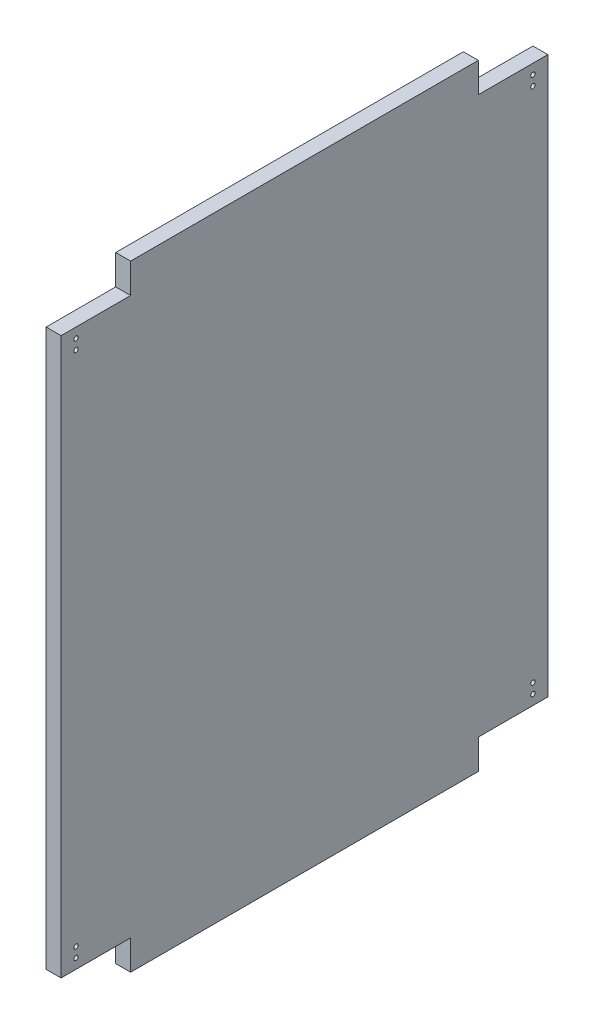
ISO-10303-21;
HEADER;
FILE_DESCRIPTION(('STEP AP214'),'2;1');
FILE_NAME('part.step','',(''),(''),'','','');
FILE_SCHEMA(('AUTOMOTIVE_DESIGN { 1 0 10303 214 1 1 1 1 }'));
ENDSEC;
DATA;
#1=APPLICATION_CONTEXT('core data for automotive mechanical design processes');
#2=APPLICATION_PROTOCOL_DEFINITION('international standard','automotive_design',2000,#1);
#3=PRODUCT_CONTEXT('',#1,'mechanical');
#4=PRODUCT('Part','Part','',(#3));
#5=PRODUCT_RELATED_PRODUCT_CATEGORY('part','',(#4));
#6=PRODUCT_DEFINITION_FORMATION('','',#4);
#7=PRODUCT_DEFINITION_CONTEXT('part definition',#1,'design');
#8=PRODUCT_DEFINITION('design','',#6,#7);
#9=PRODUCT_DEFINITION_SHAPE('','',#8);
#10=(LENGTH_UNIT() NAMED_UNIT(*) SI_UNIT(.MILLI.,.METRE.));
#11=(NAMED_UNIT(*) PLANE_ANGLE_UNIT() SI_UNIT($,.RADIAN.));
#12=(NAMED_UNIT(*) SI_UNIT($,.STERADIAN.) SOLID_ANGLE_UNIT());
#13=UNCERTAINTY_MEASURE_WITH_UNIT(LENGTH_MEASURE(1.E-05),#10,'distance_accuracy_value','');
#14=(GEOMETRIC_REPRESENTATION_CONTEXT(3) GLOBAL_UNCERTAINTY_ASSIGNED_CONTEXT((#13)) GLOBAL_UNIT_ASSIGNED_CONTEXT((#10,
#11,#12)) REPRESENTATION_CONTEXT('',''));
#15=CARTESIAN_POINT('',(0.,0.,0.));
#16=DIRECTION('',(0.,0.,1.));
#17=DIRECTION('',(1.,0.,0.));
#18=AXIS2_PLACEMENT_3D('',#15,#16,#17);
#19=CARTESIAN_POINT('',(-19.05,0.,0.));
#20=DIRECTION('',(0.,0.,-1.));
#21=DIRECTION('',(0.,1.,0.));
#22=AXIS2_PLACEMENT_3D('',#19,#20,#21);
#23=PLANE('',#22);
#24=DIRECTION('',(-1.,0.,0.));
#25=VECTOR('',#24,1.);
#26=CARTESIAN_POINT('',(0.,38.1,0.));
#27=LINE('',#26,#25);
#28=CARTESIAN_POINT('',(0.,38.1,0.));
#29=VERTEX_POINT('',#28);
#30=CARTESIAN_POINT('',(-19.05,38.1,0.));
#31=VERTEX_POINT('',#30);
#32=EDGE_CURVE('E203',#29,#31,#27,.T.);
#33=ORIENTED_EDGE('',*,*,#32,.T.);
#34=DIRECTION('',(0.,1.,0.));
#35=VECTOR('',#34,1.);
#36=CARTESIAN_POINT('',(-19.05,0.,0.));
#37=LINE('',#36,#35);
#38=CARTESIAN_POINT('',(-19.05,749.3,0.));
#39=VERTEX_POINT('',#38);
#40=EDGE_CURVE('E156',#31,#39,#37,.T.);
#41=ORIENTED_EDGE('',*,*,#40,.T.);
#42=DIRECTION('',(-1.,0.,0.));
#43=VECTOR('',#42,1.);
#44=CARTESIAN_POINT('',(0.,749.3,0.));
#45=LINE('',#44,#43);
#46=CARTESIAN_POINT('',(0.,749.3,0.));
#47=VERTEX_POINT('',#46);
#48=EDGE_CURVE('E176',#47,#39,#45,.T.);
#49=ORIENTED_EDGE('',*,*,#48,.F.);
#50=DIRECTION('',(0.,1.,0.));
#51=VECTOR('',#50,1.);
#52=CARTESIAN_POINT('',(0.,0.,0.));
#53=LINE('',#52,#51);
#54=EDGE_CURVE('E160',#29,#47,#53,.T.);
#55=ORIENTED_EDGE('',*,*,#54,.F.);
#56=EDGE_LOOP('',(#33,#41,#49,#55));
#57=FACE_BOUND('',#56,.T.);
#58=ADVANCED_FACE('F36',(#57),#23,.T.);
#59=CARTESIAN_POINT('',(-19.05,0.,0.));
#60=DIRECTION('',(0.,-1.,0.));
#61=DIRECTION('',(0.,0.,-1.));
#62=AXIS2_PLACEMENT_3D('',#59,#60,#61);
#63=PLANE('',#62);
#64=DIRECTION('',(-1.,0.,0.));
#65=VECTOR('',#64,1.);
#66=CARTESIAN_POINT('',(0.,0.,88.9));
#67=LINE('',#66,#65);
#68=CARTESIAN_POINT('',(0.,0.,88.9));
#69=VERTEX_POINT('',#68);
#70=CARTESIAN_POINT('',(-19.05,0.,88.9));
#71=VERTEX_POINT('',#70);
#72=EDGE_CURVE('E197',#69,#71,#67,.T.);
#73=ORIENTED_EDGE('',*,*,#72,.F.);
#74=DIRECTION('',(0.,0.,-1.));
#75=VECTOR('',#74,1.);
#76=CARTESIAN_POINT('',(0.,0.,0.));
#77=LINE('',#76,#75);
#78=CARTESIAN_POINT('',(0.,0.,533.4));
#79=VERTEX_POINT('',#78);
#80=EDGE_CURVE('E39',#79,#69,#77,.T.);
#81=ORIENTED_EDGE('',*,*,#80,.F.);
#82=DIRECTION('',(-1.,0.,0.));
#83=VECTOR('',#82,1.);
#84=CARTESIAN_POINT('',(0.,0.,533.4));
#85=LINE('',#84,#83);
#86=CARTESIAN_POINT('',(-19.05,0.,533.4));
#87=VERTEX_POINT('',#86);
#88=EDGE_CURVE('E201',#79,#87,#85,.T.);
#89=ORIENTED_EDGE('',*,*,#88,.T.);
#90=DIRECTION('',(0.,0.,-1.));
#91=VECTOR('',#90,1.);
#92=CARTESIAN_POINT('',(-19.05,0.,0.));
#93=LINE('',#92,#91);
#94=EDGE_CURVE('E11',#87,#71,#93,.T.);
#95=ORIENTED_EDGE('',*,*,#94,.T.);
#96=EDGE_LOOP('',(#73,#81,#89,#95));
#97=FACE_BOUND('',#96,.T.);
#98=ADVANCED_FACE('F324',(#97),#63,.T.);
#99=CARTESIAN_POINT('',(-19.05,0.,622.3));
#100=DIRECTION('',(0.,0.,1.));
#101=DIRECTION('',(1.,0.,0.));
#102=AXIS2_PLACEMENT_3D('',#99,#100,#101);
#103=PLANE('',#102);
#104=DIRECTION('',(-1.,0.,0.));
#105=VECTOR('',#104,1.);
#106=CARTESIAN_POINT('',(0.,38.1,622.3));
#107=LINE('',#106,#105);
#108=CARTESIAN_POINT('',(0.,38.1,622.3));
#109=VERTEX_POINT('',#108);
#110=CARTESIAN_POINT('',(-19.05,38.1,622.3));
#111=VERTEX_POINT('',#110);
#112=EDGE_CURVE('E213',#109,#111,#107,.T.);
#113=ORIENTED_EDGE('',*,*,#112,.F.);
#114=DIRECTION('',(0.,-1.,0.));
#115=VECTOR('',#114,1.);
#116=CARTESIAN_POINT('',(0.,0.,622.3));
#117=LINE('',#116,#115);
#118=CARTESIAN_POINT('',(0.,749.3,622.3));
#119=VERTEX_POINT('',#118);
#120=EDGE_CURVE('E145',#119,#109,#117,.T.);
#121=ORIENTED_EDGE('',*,*,#120,.F.);
#122=DIRECTION('',(-1.,0.,0.));
#123=VECTOR('',#122,1.);
#124=CARTESIAN_POINT('',(0.,749.3,622.3));
#125=LINE('',#124,#123);
#126=CARTESIAN_POINT('',(-19.05,749.3,622.3));
#127=VERTEX_POINT('',#126);
#128=EDGE_CURVE('E128',#119,#127,#125,.T.);
#129=ORIENTED_EDGE('',*,*,#128,.T.);
#130=DIRECTION('',(0.,-1.,0.));
#131=VECTOR('',#130,1.);
#132=CARTESIAN_POINT('',(-19.05,0.,622.3));
#133=LINE('',#132,#131);
#134=EDGE_CURVE('E44',#127,#111,#133,.T.);
#135=ORIENTED_EDGE('',*,*,#134,.T.);
#136=EDGE_LOOP('',(#113,#121,#129,#135));
#137=FACE_BOUND('',#136,.T.);
#138=ADVANCED_FACE('F143',(#137),#103,.T.);
#139=CARTESIAN_POINT('',(-19.05,787.4,0.));
#140=DIRECTION('',(0.,1.,0.));
#141=DIRECTION('',(0.,0.,1.));
#142=AXIS2_PLACEMENT_3D('',#139,#140,#141);
#143=PLANE('',#142);
#144=DIRECTION('',(-1.,0.,0.));
#145=VECTOR('',#144,1.);
#146=CARTESIAN_POINT('',(0.,787.4,533.4));
#147=LINE('',#146,#145);
#148=CARTESIAN_POINT('',(0.,787.4,533.4));
#149=VERTEX_POINT('',#148);
#150=CARTESIAN_POINT('',(-19.05,787.4,533.4));
#151=VERTEX_POINT('',#150);
#152=EDGE_CURVE('E225',#149,#151,#147,.T.);
#153=ORIENTED_EDGE('',*,*,#152,.F.);
#154=DIRECTION('',(0.,0.,1.));
#155=VECTOR('',#154,1.);
#156=CARTESIAN_POINT('',(0.,787.4,0.));
#157=LINE('',#156,#155);
#158=CARTESIAN_POINT('',(0.,787.4,88.9));
#159=VERTEX_POINT('',#158);
#160=EDGE_CURVE('E163',#159,#149,#157,.T.);
#161=ORIENTED_EDGE('',*,*,#160,.F.);
#162=DIRECTION('',(-1.,0.,0.));
#163=VECTOR('',#162,1.);
#164=CARTESIAN_POINT('',(0.,787.4,88.9));
#165=LINE('',#164,#163);
#166=CARTESIAN_POINT('',(-19.05,787.4,88.9));
#167=VERTEX_POINT('',#166);
#168=EDGE_CURVE('E164',#159,#167,#165,.T.);
#169=ORIENTED_EDGE('',*,*,#168,.T.);
#170=DIRECTION('',(0.,0.,1.));
#171=VECTOR('',#170,1.);
#172=CARTESIAN_POINT('',(-19.05,787.4,0.));
#173=LINE('',#172,#171);
#174=EDGE_CURVE('E153',#167,#151,#173,.T.);
#175=ORIENTED_EDGE('',*,*,#174,.T.);
#176=EDGE_LOOP('',(#153,#161,#169,#175));
#177=FACE_BOUND('',#176,.T.);
#178=ADVANCED_FACE('F309',(#177),#143,.T.);
#179=CARTESIAN_POINT('',(-19.05,0.,0.));
#180=DIRECTION('',(1.,0.,0.));
#181=DIRECTION('',(0.,0.,-1.));
#182=AXIS2_PLACEMENT_3D('',#179,#180,#181);
#183=PLANE('',#182);
#184=CARTESIAN_POINT('',(-19.05,50.8,603.25));
#185=DIRECTION('',(1.,0.,0.));
#186=DIRECTION('',(0.,0.,-1.));
#187=AXIS2_PLACEMENT_3D('',#184,#185,#186);
#188=CIRCLE('',#187,2.8067);
#189=CARTESIAN_POINT('',(-19.05,50.8,600.4433));
#190=VERTEX_POINT('',#189);
#191=EDGE_CURVE('E270',#190,#190,#188,.T.);
#192=ORIENTED_EDGE('',*,*,#191,.T.);
#193=EDGE_LOOP('',(#192));
#194=FACE_BOUND('',#193,.T.);
#195=CARTESIAN_POINT('',(-19.05,63.5,603.25));
#196=DIRECTION('',(1.,0.,0.));
#197=DIRECTION('',(0.,0.,-1.));
#198=AXIS2_PLACEMENT_3D('',#195,#196,#197);
#199=CIRCLE('',#198,2.8067);
#200=CARTESIAN_POINT('',(-19.05,63.5,600.4433));
#201=VERTEX_POINT('',#200);
#202=EDGE_CURVE('E264',#201,#201,#199,.T.);
#203=ORIENTED_EDGE('',*,*,#202,.T.);
#204=EDGE_LOOP('',(#203));
#205=FACE_BOUND('',#204,.T.);
#206=CARTESIAN_POINT('',(-19.05,50.8,19.05));
#207=DIRECTION('',(1.,0.,0.));
#208=DIRECTION('',(0.,0.,-1.));
#209=AXIS2_PLACEMENT_3D('',#206,#207,#208);
#210=CIRCLE('',#209,2.8067);
#211=CARTESIAN_POINT('',(-19.05,50.8,16.2433));
#212=VERTEX_POINT('',#211);
#213=EDGE_CURVE('E258',#212,#212,#210,.T.);
#214=ORIENTED_EDGE('',*,*,#213,.T.);
#215=EDGE_LOOP('',(#214));
#216=FACE_BOUND('',#215,.T.);
#217=CARTESIAN_POINT('',(-19.05,63.5,19.05));
#218=DIRECTION('',(1.,0.,0.));
#219=DIRECTION('',(0.,0.,-1.));
#220=AXIS2_PLACEMENT_3D('',#217,#218,#219);
#221=CIRCLE('',#220,2.8067);
#222=CARTESIAN_POINT('',(-19.05,63.5,16.2433));
#223=VERTEX_POINT('',#222);
#224=EDGE_CURVE('E252',#223,#223,#221,.T.);
#225=ORIENTED_EDGE('',*,*,#224,.T.);
#226=EDGE_LOOP('',(#225));
#227=FACE_BOUND('',#226,.T.);
#228=CARTESIAN_POINT('',(-19.05,723.9,19.0500000000001));
#229=DIRECTION('',(1.,0.,0.));
#230=DIRECTION('',(0.,0.,-1.));
#231=AXIS2_PLACEMENT_3D('',#228,#229,#230);
#232=CIRCLE('',#231,2.80670000000005);
#233=CARTESIAN_POINT('',(-19.05,723.9,16.2433));
#234=VERTEX_POINT('',#233);
#235=EDGE_CURVE('E246',#234,#234,#232,.T.);
#236=ORIENTED_EDGE('',*,*,#235,.T.);
#237=EDGE_LOOP('',(#236));
#238=FACE_BOUND('',#237,.T.);
#239=CARTESIAN_POINT('',(-19.05,736.6,19.0500000000001));
#240=DIRECTION('',(1.,0.,0.));
#241=DIRECTION('',(0.,0.,-1.));
#242=AXIS2_PLACEMENT_3D('',#239,#240,#241);
#243=CIRCLE('',#242,2.80670000000005);
#244=CARTESIAN_POINT('',(-19.05,736.6,16.2433));
#245=VERTEX_POINT('',#244);
#246=EDGE_CURVE('E240',#245,#245,#243,.T.);
#247=ORIENTED_EDGE('',*,*,#246,.T.);
#248=EDGE_LOOP('',(#247));
#249=FACE_BOUND('',#248,.T.);
#250=CARTESIAN_POINT('',(-19.05,723.9,603.25));
#251=DIRECTION('',(1.,0.,0.));
#252=DIRECTION('',(0.,0.,-1.));
#253=AXIS2_PLACEMENT_3D('',#250,#251,#252);
#254=CIRCLE('',#253,2.80670000000005);
#255=CARTESIAN_POINT('',(-19.05,723.9,600.4433));
#256=VERTEX_POINT('',#255);
#257=EDGE_CURVE('E234',#256,#256,#254,.T.);
#258=ORIENTED_EDGE('',*,*,#257,.T.);
#259=EDGE_LOOP('',(#258));
#260=FACE_BOUND('',#259,.T.);
#261=CARTESIAN_POINT('',(-19.05,736.6,603.25));
#262=DIRECTION('',(1.,0.,0.));
#263=DIRECTION('',(0.,0.,-1.));
#264=AXIS2_PLACEMENT_3D('',#261,#262,#263);
#265=CIRCLE('',#264,2.80670000000005);
#266=CARTESIAN_POINT('',(-19.05,736.6,600.4433));
#267=VERTEX_POINT('',#266);
#268=EDGE_CURVE('E206',#267,#267,#265,.T.);
#269=ORIENTED_EDGE('',*,*,#268,.T.);
#270=EDGE_LOOP('',(#269));
#271=FACE_BOUND('',#270,.T.);
#272=ORIENTED_EDGE('',*,*,#40,.F.);
#273=DIRECTION('',(0.,0.,-1.));
#274=VECTOR('',#273,1.);
#275=CARTESIAN_POINT('',(-19.05,38.1,0.));
#276=LINE('',#275,#274);
#277=CARTESIAN_POINT('',(-19.05,38.1,88.9));
#278=VERTEX_POINT('',#277);
#279=EDGE_CURVE('E195',#278,#31,#276,.T.);
#280=ORIENTED_EDGE('',*,*,#279,.F.);
#281=DIRECTION('',(0.,1.,0.));
#282=VECTOR('',#281,1.);
#283=CARTESIAN_POINT('',(-19.05,0.,88.9));
#284=LINE('',#283,#282);
#285=EDGE_CURVE('E198',#71,#278,#284,.T.);
#286=ORIENTED_EDGE('',*,*,#285,.F.);
#287=ORIENTED_EDGE('',*,*,#94,.F.);
#288=DIRECTION('',(0.,-1.,0.));
#289=VECTOR('',#288,1.);
#290=CARTESIAN_POINT('',(-19.05,0.,533.4));
#291=LINE('',#290,#289);
#292=CARTESIAN_POINT('',(-19.05,38.1,533.4));
#293=VERTEX_POINT('',#292);
#294=EDGE_CURVE('E211',#293,#87,#291,.T.);
#295=ORIENTED_EDGE('',*,*,#294,.F.);
#296=DIRECTION('',(0.,0.,-1.));
#297=VECTOR('',#296,1.);
#298=CARTESIAN_POINT('',(-19.05,38.1,622.3));
#299=LINE('',#298,#297);
#300=EDGE_CURVE('E146',#111,#293,#299,.T.);
#301=ORIENTED_EDGE('',*,*,#300,.F.);
#302=ORIENTED_EDGE('',*,*,#134,.F.);
#303=DIRECTION('',(0.,0.,1.));
#304=VECTOR('',#303,1.);
#305=CARTESIAN_POINT('',(-19.05,749.3,622.3));
#306=LINE('',#305,#304);
#307=CARTESIAN_POINT('',(-19.05,749.3,533.4));
#308=VERTEX_POINT('',#307);
#309=EDGE_CURVE('E125',#308,#127,#306,.T.);
#310=ORIENTED_EDGE('',*,*,#309,.F.);
#311=DIRECTION('',(0.,-1.,0.));
#312=VECTOR('',#311,1.);
#313=CARTESIAN_POINT('',(-19.05,787.4,533.4));
#314=LINE('',#313,#312);
#315=EDGE_CURVE('E136',#151,#308,#314,.T.);
#316=ORIENTED_EDGE('',*,*,#315,.F.);
#317=ORIENTED_EDGE('',*,*,#174,.F.);
#318=DIRECTION('',(0.,1.,0.));
#319=VECTOR('',#318,1.);
#320=CARTESIAN_POINT('',(-19.05,787.4,88.9));
#321=LINE('',#320,#319);
#322=CARTESIAN_POINT('',(-19.05,749.3,88.9));
#323=VERTEX_POINT('',#322);
#324=EDGE_CURVE('E183',#323,#167,#321,.T.);
#325=ORIENTED_EDGE('',*,*,#324,.F.);
#326=DIRECTION('',(0.,0.,1.));
#327=VECTOR('',#326,1.);
#328=CARTESIAN_POINT('',(-19.05,749.3,0.));
#329=LINE('',#328,#327);
#330=EDGE_CURVE('E186',#39,#323,#329,.T.);
#331=ORIENTED_EDGE('',*,*,#330,.F.);
#332=EDGE_LOOP('',(#272,#280,#286,#287,#295,#301,#302,#310,#316,#317,#325,#331));
#333=FACE_BOUND('',#332,.T.);
#334=ADVANCED_FACE('F150',(#194,#205,#216,#227,#238,#249,#260,#271,#333),#183,.F.);
#335=CARTESIAN_POINT('',(0.,0.,0.));
#336=DIRECTION('',(1.,0.,0.));
#337=DIRECTION('',(0.,0.,-1.));
#338=AXIS2_PLACEMENT_3D('',#335,#336,#337);
#339=PLANE('',#338);
#340=CARTESIAN_POINT('',(0.,50.8,603.25));
#341=DIRECTION('',(1.,0.,0.));
#342=DIRECTION('',(0.,0.,-1.));
#343=AXIS2_PLACEMENT_3D('',#340,#341,#342);
#344=CIRCLE('',#343,2.80669999999999);
#345=CARTESIAN_POINT('',(0.,50.8,600.4433));
#346=VERTEX_POINT('',#345);
#347=EDGE_CURVE('E273',#346,#346,#344,.T.);
#348=ORIENTED_EDGE('',*,*,#347,.F.);
#349=EDGE_LOOP('',(#348));
#350=FACE_BOUND('',#349,.T.);
#351=CARTESIAN_POINT('',(0.,63.5,603.25));
#352=DIRECTION('',(1.,0.,0.));
#353=DIRECTION('',(0.,0.,-1.));
#354=AXIS2_PLACEMENT_3D('',#351,#352,#353);
#355=CIRCLE('',#354,2.8067);
#356=CARTESIAN_POINT('',(0.,63.5,600.4433));
#357=VERTEX_POINT('',#356);
#358=EDGE_CURVE('E267',#357,#357,#355,.T.);
#359=ORIENTED_EDGE('',*,*,#358,.F.);
#360=EDGE_LOOP('',(#359));
#361=FACE_BOUND('',#360,.T.);
#362=CARTESIAN_POINT('',(0.,50.8,19.05));
#363=DIRECTION('',(1.,0.,0.));
#364=DIRECTION('',(0.,0.,-1.));
#365=AXIS2_PLACEMENT_3D('',#362,#363,#364);
#366=CIRCLE('',#365,2.80669999999999);
#367=CARTESIAN_POINT('',(0.,50.8,16.2433));
#368=VERTEX_POINT('',#367);
#369=EDGE_CURVE('E261',#368,#368,#366,.T.);
#370=ORIENTED_EDGE('',*,*,#369,.F.);
#371=EDGE_LOOP('',(#370));
#372=FACE_BOUND('',#371,.T.);
#373=CARTESIAN_POINT('',(0.,63.5,19.05));
#374=DIRECTION('',(1.,0.,0.));
#375=DIRECTION('',(0.,0.,-1.));
#376=AXIS2_PLACEMENT_3D('',#373,#374,#375);
#377=CIRCLE('',#376,2.8067);
#378=CARTESIAN_POINT('',(0.,63.5,16.2433));
#379=VERTEX_POINT('',#378);
#380=EDGE_CURVE('E255',#379,#379,#377,.T.);
#381=ORIENTED_EDGE('',*,*,#380,.F.);
#382=EDGE_LOOP('',(#381));
#383=FACE_BOUND('',#382,.T.);
#384=CARTESIAN_POINT('',(0.,723.9,19.0500000000001));
#385=DIRECTION('',(1.,0.,0.));
#386=DIRECTION('',(0.,0.,-1.));
#387=AXIS2_PLACEMENT_3D('',#384,#385,#386);
#388=CIRCLE('',#387,2.80669999999994);
#389=CARTESIAN_POINT('',(0.,723.9,16.2433000000001));
#390=VERTEX_POINT('',#389);
#391=EDGE_CURVE('E249',#390,#390,#388,.T.);
#392=ORIENTED_EDGE('',*,*,#391,.F.);
#393=EDGE_LOOP('',(#392));
#394=FACE_BOUND('',#393,.T.);
#395=CARTESIAN_POINT('',(0.,736.6,19.0500000000001));
#396=DIRECTION('',(1.,0.,0.));
#397=DIRECTION('',(0.,0.,-1.));
#398=AXIS2_PLACEMENT_3D('',#395,#396,#397);
#399=CIRCLE('',#398,2.80669999999994);
#400=CARTESIAN_POINT('',(0.,736.6,16.2433000000001));
#401=VERTEX_POINT('',#400);
#402=EDGE_CURVE('E243',#401,#401,#399,.T.);
#403=ORIENTED_EDGE('',*,*,#402,.F.);
#404=EDGE_LOOP('',(#403));
#405=FACE_BOUND('',#404,.T.);
#406=CARTESIAN_POINT('',(0.,723.9,603.25));
#407=DIRECTION('',(1.,0.,0.));
#408=DIRECTION('',(0.,0.,-1.));
#409=AXIS2_PLACEMENT_3D('',#406,#407,#408);
#410=CIRCLE('',#409,2.80669999999994);
#411=CARTESIAN_POINT('',(0.,723.9,600.4433));
#412=VERTEX_POINT('',#411);
#413=EDGE_CURVE('E237',#412,#412,#410,.T.);
#414=ORIENTED_EDGE('',*,*,#413,.F.);
#415=EDGE_LOOP('',(#414));
#416=FACE_BOUND('',#415,.T.);
#417=CARTESIAN_POINT('',(0.,736.6,603.25));
#418=DIRECTION('',(1.,0.,0.));
#419=DIRECTION('',(0.,0.,-1.));
#420=AXIS2_PLACEMENT_3D('',#417,#418,#419);
#421=CIRCLE('',#420,2.80669999999994);
#422=CARTESIAN_POINT('',(0.,736.6,600.4433));
#423=VERTEX_POINT('',#422);
#424=EDGE_CURVE('E231',#423,#423,#421,.T.);
#425=ORIENTED_EDGE('',*,*,#424,.F.);
#426=EDGE_LOOP('',(#425));
#427=FACE_BOUND('',#426,.T.);
#428=DIRECTION('',(0.,0.,-1.));
#429=VECTOR('',#428,1.);
#430=CARTESIAN_POINT('',(0.,38.1,0.));
#431=LINE('',#430,#429);
#432=CARTESIAN_POINT('',(0.,38.1,88.9));
#433=VERTEX_POINT('',#432);
#434=EDGE_CURVE('E52',#433,#29,#431,.T.);
#435=ORIENTED_EDGE('',*,*,#434,.T.);
#436=ORIENTED_EDGE('',*,*,#54,.T.);
#437=DIRECTION('',(0.,0.,1.));
#438=VECTOR('',#437,1.);
#439=CARTESIAN_POINT('',(0.,749.3,0.));
#440=LINE('',#439,#438);
#441=CARTESIAN_POINT('',(0.,749.3,88.9));
#442=VERTEX_POINT('',#441);
#443=EDGE_CURVE('E185',#47,#442,#440,.T.);
#444=ORIENTED_EDGE('',*,*,#443,.T.);
#445=DIRECTION('',(0.,1.,0.));
#446=VECTOR('',#445,1.);
#447=CARTESIAN_POINT('',(0.,787.4,88.9));
#448=LINE('',#447,#446);
#449=EDGE_CURVE('E179',#442,#159,#448,.T.);
#450=ORIENTED_EDGE('',*,*,#449,.T.);
#451=ORIENTED_EDGE('',*,*,#160,.T.);
#452=DIRECTION('',(0.,-1.,0.));
#453=VECTOR('',#452,1.);
#454=CARTESIAN_POINT('',(0.,787.4,533.4));
#455=LINE('',#454,#453);
#456=CARTESIAN_POINT('',(0.,749.3,533.4));
#457=VERTEX_POINT('',#456);
#458=EDGE_CURVE('E137',#149,#457,#455,.T.);
#459=ORIENTED_EDGE('',*,*,#458,.T.);
#460=DIRECTION('',(0.,0.,1.));
#461=VECTOR('',#460,1.);
#462=CARTESIAN_POINT('',(0.,749.3,622.3));
#463=LINE('',#462,#461);
#464=EDGE_CURVE('E223',#457,#119,#463,.T.);
#465=ORIENTED_EDGE('',*,*,#464,.T.);
#466=ORIENTED_EDGE('',*,*,#120,.T.);
#467=DIRECTION('',(0.,0.,-1.));
#468=VECTOR('',#467,1.);
#469=CARTESIAN_POINT('',(0.,38.1,622.3));
#470=LINE('',#469,#468);
#471=CARTESIAN_POINT('',(0.,38.1,533.4));
#472=VERTEX_POINT('',#471);
#473=EDGE_CURVE('E209',#109,#472,#470,.T.);
#474=ORIENTED_EDGE('',*,*,#473,.T.);
#475=DIRECTION('',(0.,-1.,0.));
#476=VECTOR('',#475,1.);
#477=CARTESIAN_POINT('',(0.,0.,533.4));
#478=LINE('',#477,#476);
#479=EDGE_CURVE('E60',#472,#79,#478,.T.);
#480=ORIENTED_EDGE('',*,*,#479,.T.);
#481=ORIENTED_EDGE('',*,*,#80,.T.);
#482=DIRECTION('',(0.,1.,0.));
#483=VECTOR('',#482,1.);
#484=CARTESIAN_POINT('',(0.,0.,88.9));
#485=LINE('',#484,#483);
#486=EDGE_CURVE('E193',#69,#433,#485,.T.);
#487=ORIENTED_EDGE('',*,*,#486,.T.);
#488=EDGE_LOOP('',(#435,#436,#444,#450,#451,#459,#465,#466,#474,#480,#481,#487));
#489=FACE_BOUND('',#488,.T.);
#490=ADVANCED_FACE('F279',(#350,#361,#372,#383,#394,#405,#416,#427,#489),#339,.T.);
#491=CARTESIAN_POINT('',(0.,787.4,88.9));
#492=DIRECTION('',(0.,0.,1.));
#493=DIRECTION('',(1.,0.,0.));
#494=AXIS2_PLACEMENT_3D('',#491,#492,#493);
#495=PLANE('',#494);
#496=ORIENTED_EDGE('',*,*,#324,.T.);
#497=ORIENTED_EDGE('',*,*,#168,.F.);
#498=ORIENTED_EDGE('',*,*,#449,.F.);
#499=DIRECTION('',(-1.,0.,0.));
#500=VECTOR('',#499,1.);
#501=CARTESIAN_POINT('',(0.,749.3,88.9));
#502=LINE('',#501,#500);
#503=EDGE_CURVE('E178',#442,#323,#502,.T.);
#504=ORIENTED_EDGE('',*,*,#503,.T.);
#505=EDGE_LOOP('',(#496,#497,#498,#504));
#506=FACE_BOUND('',#505,.T.);
#507=ADVANCED_FACE('F282',(#506),#495,.F.);
#508=CARTESIAN_POINT('',(0.,749.3,0.));
#509=DIRECTION('',(0.,-1.,0.));
#510=DIRECTION('',(0.,0.,-1.));
#511=AXIS2_PLACEMENT_3D('',#508,#509,#510);
#512=PLANE('',#511);
#513=ORIENTED_EDGE('',*,*,#330,.T.);
#514=ORIENTED_EDGE('',*,*,#503,.F.);
#515=ORIENTED_EDGE('',*,*,#443,.F.);
#516=ORIENTED_EDGE('',*,*,#48,.T.);
#517=EDGE_LOOP('',(#513,#514,#515,#516));
#518=FACE_BOUND('',#517,.T.);
#519=ADVANCED_FACE('F300',(#518),#512,.F.);
#520=CARTESIAN_POINT('',(0.,749.3,622.3));
#521=DIRECTION('',(0.,-1.,0.));
#522=DIRECTION('',(0.,0.,-1.));
#523=AXIS2_PLACEMENT_3D('',#520,#521,#522);
#524=PLANE('',#523);
#525=ORIENTED_EDGE('',*,*,#309,.T.);
#526=ORIENTED_EDGE('',*,*,#128,.F.);
#527=ORIENTED_EDGE('',*,*,#464,.F.);
#528=DIRECTION('',(-1.,0.,0.));
#529=VECTOR('',#528,1.);
#530=CARTESIAN_POINT('',(0.,749.3,533.4));
#531=LINE('',#530,#529);
#532=EDGE_CURVE('E131',#457,#308,#531,.T.);
#533=ORIENTED_EDGE('',*,*,#532,.T.);
#534=EDGE_LOOP('',(#525,#526,#527,#533));
#535=FACE_BOUND('',#534,.T.);
#536=ADVANCED_FACE('F127',(#535),#524,.F.);
#537=CARTESIAN_POINT('',(0.,787.4,533.4));
#538=DIRECTION('',(0.,0.,-1.));
#539=DIRECTION('',(-1.,0.,0.));
#540=AXIS2_PLACEMENT_3D('',#537,#538,#539);
#541=PLANE('',#540);
#542=ORIENTED_EDGE('',*,*,#315,.T.);
#543=ORIENTED_EDGE('',*,*,#532,.F.);
#544=ORIENTED_EDGE('',*,*,#458,.F.);
#545=ORIENTED_EDGE('',*,*,#152,.T.);
#546=EDGE_LOOP('',(#542,#543,#544,#545));
#547=FACE_BOUND('',#546,.T.);
#548=ADVANCED_FACE('F311',(#547),#541,.F.);
#549=CARTESIAN_POINT('',(0.,0.,533.4));
#550=DIRECTION('',(0.,0.,-1.));
#551=DIRECTION('',(-1.,0.,0.));
#552=AXIS2_PLACEMENT_3D('',#549,#550,#551);
#553=PLANE('',#552);
#554=ORIENTED_EDGE('',*,*,#294,.T.);
#555=ORIENTED_EDGE('',*,*,#88,.F.);
#556=ORIENTED_EDGE('',*,*,#479,.F.);
#557=DIRECTION('',(-1.,0.,0.));
#558=VECTOR('',#557,1.);
#559=CARTESIAN_POINT('',(0.,38.1,533.4));
#560=LINE('',#559,#558);
#561=EDGE_CURVE('E218',#472,#293,#560,.T.);
#562=ORIENTED_EDGE('',*,*,#561,.T.);
#563=EDGE_LOOP('',(#554,#555,#556,#562));
#564=FACE_BOUND('',#563,.T.);
#565=ADVANCED_FACE('F313',(#564),#553,.F.);
#566=CARTESIAN_POINT('',(0.,38.1,622.3));
#567=DIRECTION('',(0.,1.,0.));
#568=DIRECTION('',(0.,0.,1.));
#569=AXIS2_PLACEMENT_3D('',#566,#567,#568);
#570=PLANE('',#569);
#571=ORIENTED_EDGE('',*,*,#300,.T.);
#572=ORIENTED_EDGE('',*,*,#561,.F.);
#573=ORIENTED_EDGE('',*,*,#473,.F.);
#574=ORIENTED_EDGE('',*,*,#112,.T.);
#575=EDGE_LOOP('',(#571,#572,#573,#574));
#576=FACE_BOUND('',#575,.T.);
#577=ADVANCED_FACE('F319',(#576),#570,.F.);
#578=CARTESIAN_POINT('',(0.,38.1,0.));
#579=DIRECTION('',(0.,1.,0.));
#580=DIRECTION('',(0.,0.,1.));
#581=AXIS2_PLACEMENT_3D('',#578,#579,#580);
#582=PLANE('',#581);
#583=ORIENTED_EDGE('',*,*,#279,.T.);
#584=ORIENTED_EDGE('',*,*,#32,.F.);
#585=ORIENTED_EDGE('',*,*,#434,.F.);
#586=DIRECTION('',(-1.,0.,0.));
#587=VECTOR('',#586,1.);
#588=CARTESIAN_POINT('',(0.,38.1,88.9));
#589=LINE('',#588,#587);
#590=EDGE_CURVE('E205',#433,#278,#589,.T.);
#591=ORIENTED_EDGE('',*,*,#590,.T.);
#592=EDGE_LOOP('',(#583,#584,#585,#591));
#593=FACE_BOUND('',#592,.T.);
#594=ADVANCED_FACE('F349',(#593),#582,.F.);
#595=CARTESIAN_POINT('',(0.,0.,88.9));
#596=DIRECTION('',(0.,0.,1.));
#597=DIRECTION('',(1.,0.,0.));
#598=AXIS2_PLACEMENT_3D('',#595,#596,#597);
#599=PLANE('',#598);
#600=ORIENTED_EDGE('',*,*,#285,.T.);
#601=ORIENTED_EDGE('',*,*,#590,.F.);
#602=ORIENTED_EDGE('',*,*,#486,.F.);
#603=ORIENTED_EDGE('',*,*,#72,.T.);
#604=EDGE_LOOP('',(#600,#601,#602,#603));
#605=FACE_BOUND('',#604,.T.);
#606=ADVANCED_FACE('F352',(#605),#599,.F.);
#607=CARTESIAN_POINT('',(0.,736.6,603.25));
#608=DIRECTION('',(1.,0.,0.));
#609=DIRECTION('',(0.,0.,-1.));
#610=AXIS2_PLACEMENT_3D('',#607,#608,#609);
#611=CYLINDRICAL_SURFACE('',#610,2.8067);
#612=ORIENTED_EDGE('',*,*,#268,.F.);
#613=EDGE_LOOP('',(#612));
#614=FACE_BOUND('',#613,.T.);
#615=ORIENTED_EDGE('',*,*,#424,.T.);
#616=EDGE_LOOP('',(#615));
#617=FACE_BOUND('',#616,.T.);
#618=ADVANCED_FACE('F354',(#614,#617),#611,.F.);
#619=CARTESIAN_POINT('',(0.,723.9,603.25));
#620=DIRECTION('',(1.,0.,0.));
#621=DIRECTION('',(0.,0.,-1.));
#622=AXIS2_PLACEMENT_3D('',#619,#620,#621);
#623=CYLINDRICAL_SURFACE('',#622,2.8067);
#624=ORIENTED_EDGE('',*,*,#257,.F.);
#625=EDGE_LOOP('',(#624));
#626=FACE_BOUND('',#625,.T.);
#627=ORIENTED_EDGE('',*,*,#413,.T.);
#628=EDGE_LOOP('',(#627));
#629=FACE_BOUND('',#628,.T.);
#630=ADVANCED_FACE('F379',(#626,#629),#623,.F.);
#631=CARTESIAN_POINT('',(0.,736.6,19.0500000000001));
#632=DIRECTION('',(1.,0.,0.));
#633=DIRECTION('',(0.,0.,-1.));
#634=AXIS2_PLACEMENT_3D('',#631,#632,#633);
#635=CYLINDRICAL_SURFACE('',#634,2.8067);
#636=ORIENTED_EDGE('',*,*,#246,.F.);
#637=EDGE_LOOP('',(#636));
#638=FACE_BOUND('',#637,.T.);
#639=ORIENTED_EDGE('',*,*,#402,.T.);
#640=EDGE_LOOP('',(#639));
#641=FACE_BOUND('',#640,.T.);
#642=ADVANCED_FACE('F387',(#638,#641),#635,.F.);
#643=CARTESIAN_POINT('',(0.,723.9,19.0500000000001));
#644=DIRECTION('',(1.,0.,0.));
#645=DIRECTION('',(0.,0.,-1.));
#646=AXIS2_PLACEMENT_3D('',#643,#644,#645);
#647=CYLINDRICAL_SURFACE('',#646,2.8067);
#648=ORIENTED_EDGE('',*,*,#235,.F.);
#649=EDGE_LOOP('',(#648));
#650=FACE_BOUND('',#649,.T.);
#651=ORIENTED_EDGE('',*,*,#391,.T.);
#652=EDGE_LOOP('',(#651));
#653=FACE_BOUND('',#652,.T.);
#654=ADVANCED_FACE('F395',(#650,#653),#647,.F.);
#655=CARTESIAN_POINT('',(0.,63.5,19.05));
#656=DIRECTION('',(1.,0.,0.));
#657=DIRECTION('',(0.,0.,-1.));
#658=AXIS2_PLACEMENT_3D('',#655,#656,#657);
#659=CYLINDRICAL_SURFACE('',#658,2.8067);
#660=ORIENTED_EDGE('',*,*,#224,.F.);
#661=EDGE_LOOP('',(#660));
#662=FACE_BOUND('',#661,.T.);
#663=ORIENTED_EDGE('',*,*,#380,.T.);
#664=EDGE_LOOP('',(#663));
#665=FACE_BOUND('',#664,.T.);
#666=ADVANCED_FACE('F403',(#662,#665),#659,.F.);
#667=CARTESIAN_POINT('',(0.,50.8,19.05));
#668=DIRECTION('',(1.,0.,0.));
#669=DIRECTION('',(0.,0.,-1.));
#670=AXIS2_PLACEMENT_3D('',#667,#668,#669);
#671=CYLINDRICAL_SURFACE('',#670,2.80669999999999);
#672=ORIENTED_EDGE('',*,*,#213,.F.);
#673=EDGE_LOOP('',(#672));
#674=FACE_BOUND('',#673,.T.);
#675=ORIENTED_EDGE('',*,*,#369,.T.);
#676=EDGE_LOOP('',(#675));
#677=FACE_BOUND('',#676,.T.);
#678=ADVANCED_FACE('F411',(#674,#677),#671,.F.);
#679=CARTESIAN_POINT('',(0.,63.5,603.25));
#680=DIRECTION('',(1.,0.,0.));
#681=DIRECTION('',(0.,0.,-1.));
#682=AXIS2_PLACEMENT_3D('',#679,#680,#681);
#683=CYLINDRICAL_SURFACE('',#682,2.8067);
#684=ORIENTED_EDGE('',*,*,#202,.F.);
#685=EDGE_LOOP('',(#684));
#686=FACE_BOUND('',#685,.T.);
#687=ORIENTED_EDGE('',*,*,#358,.T.);
#688=EDGE_LOOP('',(#687));
#689=FACE_BOUND('',#688,.T.);
#690=ADVANCED_FACE('F419',(#686,#689),#683,.F.);
#691=CARTESIAN_POINT('',(0.,50.8,603.25));
#692=DIRECTION('',(1.,0.,0.));
#693=DIRECTION('',(0.,0.,-1.));
#694=AXIS2_PLACEMENT_3D('',#691,#692,#693);
#695=CYLINDRICAL_SURFACE('',#694,2.80669999999999);
#696=ORIENTED_EDGE('',*,*,#191,.F.);
#697=EDGE_LOOP('',(#696));
#698=FACE_BOUND('',#697,.T.);
#699=ORIENTED_EDGE('',*,*,#347,.T.);
#700=EDGE_LOOP('',(#699));
#701=FACE_BOUND('',#700,.T.);
#702=ADVANCED_FACE('F277',(#698,#701),#695,.F.);
#703=CLOSED_SHELL('',(#58,#98,#138,#178,#334,#490,#507,#519,#536,#548,#565,#577,#594,#606,#618,
#630,#642,#654,#666,#678,#690,#702));
#704=MANIFOLD_SOLID_BREP('B2',#703);
#705=ADVANCED_BREP_SHAPE_REPRESENTATION('',(#18,#704),#14);
#706=SHAPE_DEFINITION_REPRESENTATION(#9,#705);
ENDSEC;
END-ISO-10303-21;
